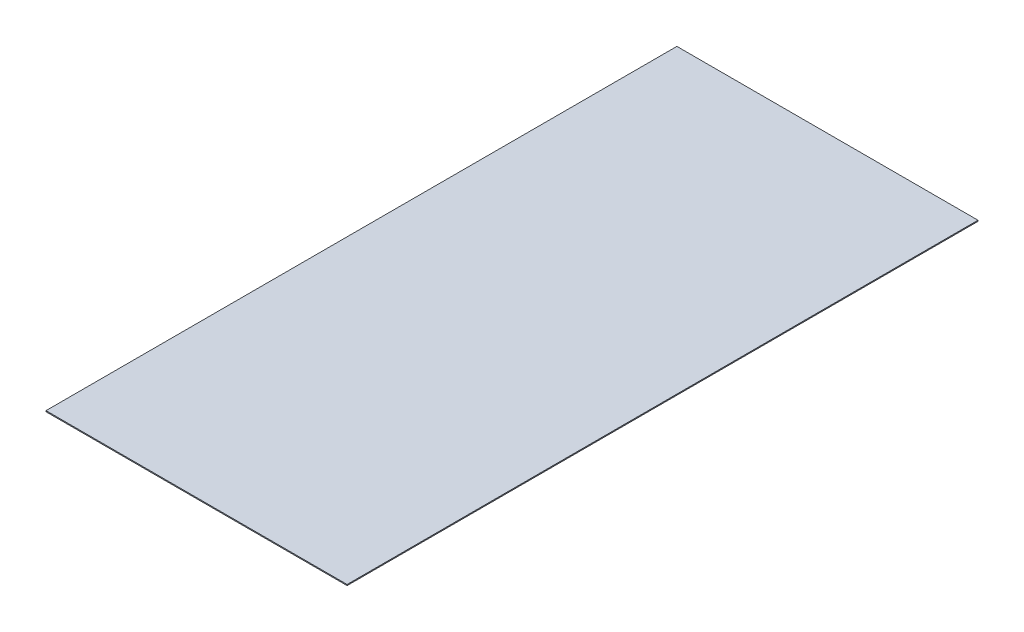
ISO-10303-21;
HEADER;
FILE_DESCRIPTION(('STEP AP214'),'2;1');
FILE_NAME('part.step','',(''),(''),'','','');
FILE_SCHEMA(('AUTOMOTIVE_DESIGN { 1 0 10303 214 1 1 1 1 }'));
ENDSEC;
DATA;
#1=APPLICATION_CONTEXT('core data for automotive mechanical design processes');
#2=APPLICATION_PROTOCOL_DEFINITION('international standard','automotive_design',2000,#1);
#3=PRODUCT_CONTEXT('',#1,'mechanical');
#4=PRODUCT('Part','Part','',(#3));
#5=PRODUCT_RELATED_PRODUCT_CATEGORY('part','',(#4));
#6=PRODUCT_DEFINITION_FORMATION('','',#4);
#7=PRODUCT_DEFINITION_CONTEXT('part definition',#1,'design');
#8=PRODUCT_DEFINITION('design','',#6,#7);
#9=PRODUCT_DEFINITION_SHAPE('','',#8);
#10=(LENGTH_UNIT() NAMED_UNIT(*) SI_UNIT(.MILLI.,.METRE.));
#11=(NAMED_UNIT(*) PLANE_ANGLE_UNIT() SI_UNIT($,.RADIAN.));
#12=(NAMED_UNIT(*) SI_UNIT($,.STERADIAN.) SOLID_ANGLE_UNIT());
#13=UNCERTAINTY_MEASURE_WITH_UNIT(LENGTH_MEASURE(1.E-05),#10,'distance_accuracy_value','');
#14=(GEOMETRIC_REPRESENTATION_CONTEXT(3) GLOBAL_UNCERTAINTY_ASSIGNED_CONTEXT((#13)) GLOBAL_UNIT_ASSIGNED_CONTEXT((#10,
#11,#12)) REPRESENTATION_CONTEXT('',''));
#15=CARTESIAN_POINT('',(0.,0.,0.));
#16=DIRECTION('',(0.,0.,1.));
#17=DIRECTION('',(1.,0.,0.));
#18=AXIS2_PLACEMENT_3D('',#15,#16,#17);
#19=CARTESIAN_POINT('',(-29.95,0.,62.75));
#20=DIRECTION('',(0.,1.,0.));
#21=DIRECTION('',(0.,0.,1.));
#22=AXIS2_PLACEMENT_3D('',#19,#20,#21);
#23=PLANE('',#22);
#24=DIRECTION('',(0.,0.,-1.));
#25=VECTOR('',#24,1.);
#26=CARTESIAN_POINT('',(29.95,0.,-62.75));
#27=LINE('',#26,#25);
#28=CARTESIAN_POINT('',(29.95,0.,-62.75));
#29=VERTEX_POINT('',#28);
#30=CARTESIAN_POINT('',(29.95,0.,62.75));
#31=VERTEX_POINT('',#30);
#32=EDGE_CURVE('E57',#29,#31,#27,.F.);
#33=ORIENTED_EDGE('',*,*,#32,.F.);
#34=DIRECTION('',(-1.,0.,0.));
#35=VECTOR('',#34,1.);
#36=CARTESIAN_POINT('',(-29.95,0.,-62.75));
#37=LINE('',#36,#35);
#38=CARTESIAN_POINT('',(-29.95,0.,-62.75));
#39=VERTEX_POINT('',#38);
#40=EDGE_CURVE('E52',#39,#29,#37,.F.);
#41=ORIENTED_EDGE('',*,*,#40,.F.);
#42=DIRECTION('',(0.,0.,1.));
#43=VECTOR('',#42,1.);
#44=CARTESIAN_POINT('',(-29.95,0.,-62.75));
#45=LINE('',#44,#43);
#46=CARTESIAN_POINT('',(-29.95,0.,62.75));
#47=VERTEX_POINT('',#46);
#48=EDGE_CURVE('E67',#47,#39,#45,.F.);
#49=ORIENTED_EDGE('',*,*,#48,.F.);
#50=DIRECTION('',(1.,0.,0.));
#51=VECTOR('',#50,1.);
#52=CARTESIAN_POINT('',(-29.95,0.,62.75));
#53=LINE('',#52,#51);
#54=EDGE_CURVE('E19',#31,#47,#53,.F.);
#55=ORIENTED_EDGE('',*,*,#54,.F.);
#56=EDGE_LOOP('',(#33,#41,#49,#55));
#57=FACE_BOUND('',#56,.T.);
#58=ADVANCED_FACE('F16',(#57),#23,.T.);
#59=CARTESIAN_POINT('',(-29.95,-0.2,62.75));
#60=DIRECTION('',(0.,0.,1.));
#61=DIRECTION('',(1.,0.,0.));
#62=AXIS2_PLACEMENT_3D('',#59,#60,#61);
#63=PLANE('',#62);
#64=DIRECTION('',(1.,0.,0.));
#65=VECTOR('',#64,1.);
#66=CARTESIAN_POINT('',(-29.95,-0.2,62.75));
#67=LINE('',#66,#65);
#68=CARTESIAN_POINT('',(-29.95,-0.2,62.75));
#69=VERTEX_POINT('',#68);
#70=CARTESIAN_POINT('',(29.95,-0.2,62.75));
#71=VERTEX_POINT('',#70);
#72=EDGE_CURVE('E73',#69,#71,#67,.T.);
#73=ORIENTED_EDGE('',*,*,#72,.T.);
#74=DIRECTION('',(0.,1.,0.));
#75=VECTOR('',#74,1.);
#76=CARTESIAN_POINT('',(29.95,-0.2,62.75));
#77=LINE('',#76,#75);
#78=EDGE_CURVE('E62',#31,#71,#77,.F.);
#79=ORIENTED_EDGE('',*,*,#78,.F.);
#80=ORIENTED_EDGE('',*,*,#54,.T.);
#81=DIRECTION('',(0.,1.,0.));
#82=VECTOR('',#81,1.);
#83=CARTESIAN_POINT('',(-29.95,-0.2,62.75));
#84=LINE('',#83,#82);
#85=EDGE_CURVE('E80',#69,#47,#84,.T.);
#86=ORIENTED_EDGE('',*,*,#85,.F.);
#87=EDGE_LOOP('',(#73,#79,#80,#86));
#88=FACE_BOUND('',#87,.T.);
#89=ADVANCED_FACE('F72',(#88),#63,.T.);
#90=CARTESIAN_POINT('',(29.95,-0.2,-62.75));
#91=DIRECTION('',(1.,0.,0.));
#92=DIRECTION('',(0.,0.,-1.));
#93=AXIS2_PLACEMENT_3D('',#90,#91,#92);
#94=PLANE('',#93);
#95=DIRECTION('',(0.,0.,1.));
#96=VECTOR('',#95,1.);
#97=CARTESIAN_POINT('',(29.95,-0.2,62.75));
#98=LINE('',#97,#96);
#99=CARTESIAN_POINT('',(29.95,-0.2,-62.75));
#100=VERTEX_POINT('',#99);
#101=EDGE_CURVE('E83',#71,#100,#98,.F.);
#102=ORIENTED_EDGE('',*,*,#101,.T.);
#103=DIRECTION('',(0.,1.,0.));
#104=VECTOR('',#103,1.);
#105=CARTESIAN_POINT('',(29.95,-0.2,-62.75));
#106=LINE('',#105,#104);
#107=EDGE_CURVE('E64',#29,#100,#106,.F.);
#108=ORIENTED_EDGE('',*,*,#107,.F.);
#109=ORIENTED_EDGE('',*,*,#32,.T.);
#110=ORIENTED_EDGE('',*,*,#78,.T.);
#111=EDGE_LOOP('',(#102,#108,#109,#110));
#112=FACE_BOUND('',#111,.T.);
#113=ADVANCED_FACE('F60',(#112),#94,.T.);
#114=CARTESIAN_POINT('',(-29.95,-0.2,-62.75));
#115=DIRECTION('',(0.,0.,-1.));
#116=DIRECTION('',(-1.,0.,0.));
#117=AXIS2_PLACEMENT_3D('',#114,#115,#116);
#118=PLANE('',#117);
#119=DIRECTION('',(1.,0.,0.));
#120=VECTOR('',#119,1.);
#121=CARTESIAN_POINT('',(-29.95,-0.2,-62.75));
#122=LINE('',#121,#120);
#123=CARTESIAN_POINT('',(-29.95,-0.2,-62.75));
#124=VERTEX_POINT('',#123);
#125=EDGE_CURVE('E25',#100,#124,#122,.F.);
#126=ORIENTED_EDGE('',*,*,#125,.T.);
#127=DIRECTION('',(0.,1.,0.));
#128=VECTOR('',#127,1.);
#129=CARTESIAN_POINT('',(-29.95,-0.2,-62.75));
#130=LINE('',#129,#128);
#131=EDGE_CURVE('E33',#39,#124,#130,.F.);
#132=ORIENTED_EDGE('',*,*,#131,.F.);
#133=ORIENTED_EDGE('',*,*,#40,.T.);
#134=ORIENTED_EDGE('',*,*,#107,.T.);
#135=EDGE_LOOP('',(#126,#132,#133,#134));
#136=FACE_BOUND('',#135,.T.);
#137=ADVANCED_FACE('F87',(#136),#118,.T.);
#138=CARTESIAN_POINT('',(-29.95,-0.2,-62.75));
#139=DIRECTION('',(-1.,0.,0.));
#140=DIRECTION('',(0.,0.,1.));
#141=AXIS2_PLACEMENT_3D('',#138,#139,#140);
#142=PLANE('',#141);
#143=DIRECTION('',(0.,0.,1.));
#144=VECTOR('',#143,1.);
#145=CARTESIAN_POINT('',(-29.95,-0.2,62.75));
#146=LINE('',#145,#144);
#147=EDGE_CURVE('E11',#124,#69,#146,.T.);
#148=ORIENTED_EDGE('',*,*,#147,.T.);
#149=ORIENTED_EDGE('',*,*,#85,.T.);
#150=ORIENTED_EDGE('',*,*,#48,.T.);
#151=ORIENTED_EDGE('',*,*,#131,.T.);
#152=EDGE_LOOP('',(#148,#149,#150,#151));
#153=FACE_BOUND('',#152,.T.);
#154=ADVANCED_FACE('F90',(#153),#142,.T.);
#155=CARTESIAN_POINT('',(-29.95,-0.2,62.75));
#156=DIRECTION('',(0.,1.,0.));
#157=DIRECTION('',(0.,0.,1.));
#158=AXIS2_PLACEMENT_3D('',#155,#156,#157);
#159=PLANE('',#158);
#160=ORIENTED_EDGE('',*,*,#125,.F.);
#161=ORIENTED_EDGE('',*,*,#101,.F.);
#162=ORIENTED_EDGE('',*,*,#72,.F.);
#163=ORIENTED_EDGE('',*,*,#147,.F.);
#164=EDGE_LOOP('',(#160,#161,#162,#163));
#165=FACE_BOUND('',#164,.T.);
#166=ADVANCED_FACE('F89',(#165),#159,.F.);
#167=CLOSED_SHELL('',(#58,#89,#113,#137,#154,#166));
#168=MANIFOLD_SOLID_BREP('B1',#167);
#169=ADVANCED_BREP_SHAPE_REPRESENTATION('',(#18,#168),#14);
#170=SHAPE_DEFINITION_REPRESENTATION(#9,#169);
ENDSEC;
END-ISO-10303-21;
